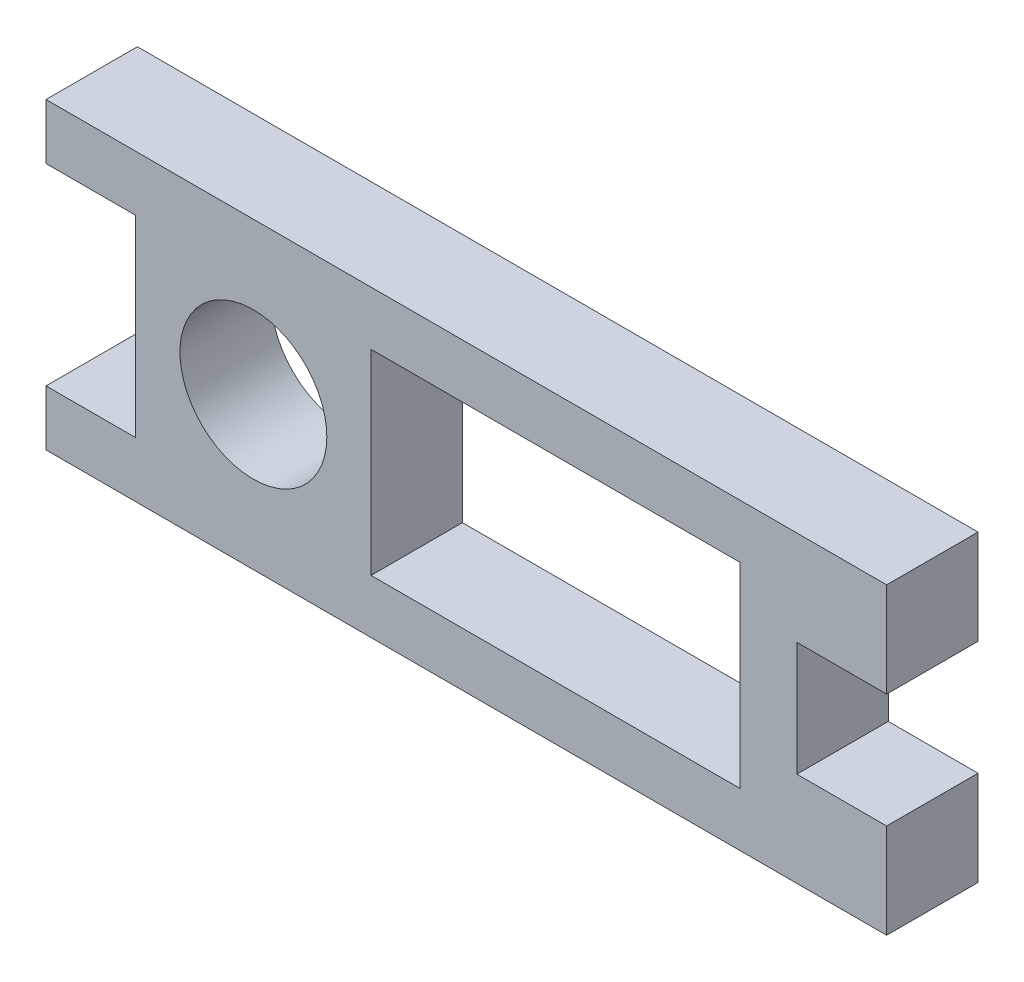
ISO-10303-21;
HEADER;
FILE_DESCRIPTION(('STEP AP214'),'2;1');
FILE_NAME('part.step','',(''),(''),'','','');
FILE_SCHEMA(('AUTOMOTIVE_DESIGN { 1 0 10303 214 1 1 1 1 }'));
ENDSEC;
DATA;
#1=APPLICATION_CONTEXT('core data for automotive mechanical design processes');
#2=APPLICATION_PROTOCOL_DEFINITION('international standard','automotive_design',2000,#1);
#3=PRODUCT_CONTEXT('',#1,'mechanical');
#4=PRODUCT('Part','Part','',(#3));
#5=PRODUCT_RELATED_PRODUCT_CATEGORY('part','',(#4));
#6=PRODUCT_DEFINITION_FORMATION('','',#4);
#7=PRODUCT_DEFINITION_CONTEXT('part definition',#1,'design');
#8=PRODUCT_DEFINITION('design','',#6,#7);
#9=PRODUCT_DEFINITION_SHAPE('','',#8);
#10=(LENGTH_UNIT() NAMED_UNIT(*) SI_UNIT(.MILLI.,.METRE.));
#11=(NAMED_UNIT(*) PLANE_ANGLE_UNIT() SI_UNIT($,.RADIAN.));
#12=(NAMED_UNIT(*) SI_UNIT($,.STERADIAN.) SOLID_ANGLE_UNIT());
#13=UNCERTAINTY_MEASURE_WITH_UNIT(LENGTH_MEASURE(1.E-05),#10,'distance_accuracy_value','');
#14=(GEOMETRIC_REPRESENTATION_CONTEXT(3) GLOBAL_UNCERTAINTY_ASSIGNED_CONTEXT((#13)) GLOBAL_UNIT_ASSIGNED_CONTEXT((#10,
#11,#12)) REPRESENTATION_CONTEXT('',''));
#15=CARTESIAN_POINT('',(0.,0.,0.));
#16=DIRECTION('',(0.,0.,1.));
#17=DIRECTION('',(1.,0.,0.));
#18=AXIS2_PLACEMENT_3D('',#15,#16,#17);
#19=CARTESIAN_POINT('',(0.,0.,5.6));
#20=DIRECTION('',(0.,0.,-1.));
#21=DIRECTION('',(-1.,0.,0.));
#22=AXIS2_PLACEMENT_3D('',#19,#20,#21);
#23=PLANE('',#22);
#24=DIRECTION('',(1.,0.,0.));
#25=VECTOR('',#24,1.);
#26=CARTESIAN_POINT('',(704.254416841144,403.699543708958,5.6));
#27=LINE('',#26,#25);
#28=CARTESIAN_POINT('',(698.754416841144,403.699543708958,5.6));
#29=VERTEX_POINT('',#28);
#30=CARTESIAN_POINT('',(704.254416841144,403.699543708958,5.6));
#31=VERTEX_POINT('',#30);
#32=EDGE_CURVE('E185',#29,#31,#27,.T.);
#33=ORIENTED_EDGE('',*,*,#32,.T.);
#34=DIRECTION('',(0.,-1.,0.));
#35=VECTOR('',#34,1.);
#36=CARTESIAN_POINT('',(704.254416841144,403.699543708958,5.6));
#37=LINE('',#36,#35);
#38=CARTESIAN_POINT('',(704.254416841144,391.899543708958,5.6));
#39=VERTEX_POINT('',#38);
#40=EDGE_CURVE('E188',#31,#39,#37,.T.);
#41=ORIENTED_EDGE('',*,*,#40,.T.);
#42=DIRECTION('',(-1.,0.,0.));
#43=VECTOR('',#42,1.);
#44=CARTESIAN_POINT('',(698.754416841144,391.899543708958,5.6));
#45=LINE('',#44,#43);
#46=CARTESIAN_POINT('',(698.754416841144,391.899543708958,5.6));
#47=VERTEX_POINT('',#46);
#48=EDGE_CURVE('E191',#39,#47,#45,.T.);
#49=ORIENTED_EDGE('',*,*,#48,.T.);
#50=DIRECTION('',(0.,-1.,0.));
#51=VECTOR('',#50,1.);
#52=CARTESIAN_POINT('',(698.754416841144,388.499543708958,5.6));
#53=LINE('',#52,#51);
#54=CARTESIAN_POINT('',(698.754416841144,388.499543708958,5.6));
#55=VERTEX_POINT('',#54);
#56=EDGE_CURVE('E193',#47,#55,#53,.T.);
#57=ORIENTED_EDGE('',*,*,#56,.T.);
#58=DIRECTION('',(1.,0.,0.));
#59=VECTOR('',#58,1.);
#60=CARTESIAN_POINT('',(750.274416841144,388.499543708958,5.6));
#61=LINE('',#60,#59);
#62=CARTESIAN_POINT('',(750.274416841144,388.499543708958,5.6));
#63=VERTEX_POINT('',#62);
#64=EDGE_CURVE('E195',#55,#63,#61,.T.);
#65=ORIENTED_EDGE('',*,*,#64,.T.);
#66=DIRECTION('',(0.,1.,0.));
#67=VECTOR('',#66,1.);
#68=CARTESIAN_POINT('',(750.274416841144,394.299543708958,5.6));
#69=LINE('',#68,#67);
#70=CARTESIAN_POINT('',(750.274416841144,394.299543708958,5.6));
#71=VERTEX_POINT('',#70);
#72=EDGE_CURVE('E197',#63,#71,#69,.T.);
#73=ORIENTED_EDGE('',*,*,#72,.T.);
#74=DIRECTION('',(-1.,0.,0.));
#75=VECTOR('',#74,1.);
#76=CARTESIAN_POINT('',(744.774416841144,394.299543708958,5.6));
#77=LINE('',#76,#75);
#78=CARTESIAN_POINT('',(744.774416841144,394.299543708958,5.6));
#79=VERTEX_POINT('',#78);
#80=EDGE_CURVE('E199',#71,#79,#77,.T.);
#81=ORIENTED_EDGE('',*,*,#80,.T.);
#82=DIRECTION('',(0.,1.,0.));
#83=VECTOR('',#82,1.);
#84=CARTESIAN_POINT('',(744.774416841144,401.299543708958,5.6));
#85=LINE('',#84,#83);
#86=CARTESIAN_POINT('',(744.774416841144,401.299543708958,5.6));
#87=VERTEX_POINT('',#86);
#88=EDGE_CURVE('E201',#79,#87,#85,.T.);
#89=ORIENTED_EDGE('',*,*,#88,.T.);
#90=DIRECTION('',(1.,0.,0.));
#91=VECTOR('',#90,1.);
#92=CARTESIAN_POINT('',(750.274416841144,401.299543708958,5.6));
#93=LINE('',#92,#91);
#94=CARTESIAN_POINT('',(750.274416841144,401.299543708958,5.6));
#95=VERTEX_POINT('',#94);
#96=EDGE_CURVE('E203',#87,#95,#93,.T.);
#97=ORIENTED_EDGE('',*,*,#96,.T.);
#98=DIRECTION('',(0.,1.,0.));
#99=VECTOR('',#98,1.);
#100=CARTESIAN_POINT('',(750.274416841144,407.099543708958,5.6));
#101=LINE('',#100,#99);
#102=CARTESIAN_POINT('',(750.274416841144,407.099543708958,5.6));
#103=VERTEX_POINT('',#102);
#104=EDGE_CURVE('E205',#95,#103,#101,.T.);
#105=ORIENTED_EDGE('',*,*,#104,.T.);
#106=DIRECTION('',(-1.,0.,0.));
#107=VECTOR('',#106,1.);
#108=CARTESIAN_POINT('',(698.754416841144,407.099543708958,5.6));
#109=LINE('',#108,#107);
#110=CARTESIAN_POINT('',(698.754416841144,407.099543708958,5.6));
#111=VERTEX_POINT('',#110);
#112=EDGE_CURVE('E207',#103,#111,#109,.T.);
#113=ORIENTED_EDGE('',*,*,#112,.T.);
#114=DIRECTION('',(0.,-1.,0.));
#115=VECTOR('',#114,1.);
#116=CARTESIAN_POINT('',(698.754416841144,403.699543708958,5.6));
#117=LINE('',#116,#115);
#118=EDGE_CURVE('E209',#111,#29,#117,.T.);
#119=ORIENTED_EDGE('',*,*,#118,.T.);
#120=EDGE_LOOP('',(#33,#41,#49,#57,#65,#73,#81,#89,#97,#105,#113,#119));
#121=FACE_BOUND('',#120,.T.);
#122=DIRECTION('',(0.,-1.,0.));
#123=VECTOR('',#122,1.);
#124=CARTESIAN_POINT('',(718.674416841144,391.799543708958,5.6));
#125=LINE('',#124,#123);
#126=CARTESIAN_POINT('',(718.674416841144,403.799543708958,5.6));
#127=VERTEX_POINT('',#126);
#128=CARTESIAN_POINT('',(718.674416841144,391.799543708958,5.6));
#129=VERTEX_POINT('',#128);
#130=EDGE_CURVE('E146',#127,#129,#125,.T.);
#131=ORIENTED_EDGE('',*,*,#130,.F.);
#132=DIRECTION('',(-1.,0.,0.));
#133=VECTOR('',#132,1.);
#134=CARTESIAN_POINT('',(718.674416841144,403.799543708958,5.6));
#135=LINE('',#134,#133);
#136=CARTESIAN_POINT('',(741.274416841144,403.799543708958,5.6));
#137=VERTEX_POINT('',#136);
#138=EDGE_CURVE('E169',#137,#127,#135,.T.);
#139=ORIENTED_EDGE('',*,*,#138,.F.);
#140=DIRECTION('',(0.,1.,0.));
#141=VECTOR('',#140,1.);
#142=CARTESIAN_POINT('',(741.274416841144,391.799543708958,5.6));
#143=LINE('',#142,#141);
#144=CARTESIAN_POINT('',(741.274416841144,391.799543708958,5.6));
#145=VERTEX_POINT('',#144);
#146=EDGE_CURVE('E167',#145,#137,#143,.T.);
#147=ORIENTED_EDGE('',*,*,#146,.F.);
#148=DIRECTION('',(1.,0.,0.));
#149=VECTOR('',#148,1.);
#150=CARTESIAN_POINT('',(718.674416841144,391.799543708958,5.6));
#151=LINE('',#150,#149);
#152=EDGE_CURVE('E154',#129,#145,#151,.T.);
#153=ORIENTED_EDGE('',*,*,#152,.F.);
#154=EDGE_LOOP('',(#131,#139,#147,#153));
#155=FACE_BOUND('',#154,.T.);
#156=CARTESIAN_POINT('',(711.464416841144,397.799543708958,5.6));
#157=DIRECTION('',(0.,0.,1.));
#158=DIRECTION('',(1.,0.,0.));
#159=AXIS2_PLACEMENT_3D('',#156,#157,#158);
#160=CIRCLE('',#159,4.49999999999991);
#161=CARTESIAN_POINT('',(715.964416841144,397.799543708958,5.6));
#162=VERTEX_POINT('',#161);
#163=EDGE_CURVE('E175',#162,#162,#160,.T.);
#164=ORIENTED_EDGE('',*,*,#163,.F.);
#165=EDGE_LOOP('',(#164));
#166=FACE_BOUND('',#165,.T.);
#167=ADVANCED_FACE('F33',(#121,#155,#166),#23,.F.);
#168=CARTESIAN_POINT('',(0.,0.,0.));
#169=DIRECTION('',(0.,0.,-1.));
#170=DIRECTION('',(-1.,0.,0.));
#171=AXIS2_PLACEMENT_3D('',#168,#169,#170);
#172=PLANE('',#171);
#173=DIRECTION('',(-1.,0.,0.));
#174=VECTOR('',#173,1.);
#175=CARTESIAN_POINT('',(718.674416841144,403.799543708958,0.));
#176=LINE('',#175,#174);
#177=CARTESIAN_POINT('',(741.274416841144,403.799543708958,0.));
#178=VERTEX_POINT('',#177);
#179=CARTESIAN_POINT('',(718.674416841144,403.799543708958,0.));
#180=VERTEX_POINT('',#179);
#181=EDGE_CURVE('E155',#178,#180,#176,.T.);
#182=ORIENTED_EDGE('',*,*,#181,.T.);
#183=DIRECTION('',(0.,-1.,0.));
#184=VECTOR('',#183,1.);
#185=CARTESIAN_POINT('',(718.674416841144,391.799543708958,0.));
#186=LINE('',#185,#184);
#187=CARTESIAN_POINT('',(718.674416841144,391.799543708958,0.));
#188=VERTEX_POINT('',#187);
#189=EDGE_CURVE('E56',#180,#188,#186,.T.);
#190=ORIENTED_EDGE('',*,*,#189,.T.);
#191=DIRECTION('',(1.,0.,0.));
#192=VECTOR('',#191,1.);
#193=CARTESIAN_POINT('',(718.674416841144,391.799543708958,0.));
#194=LINE('',#193,#192);
#195=CARTESIAN_POINT('',(741.274416841144,391.799543708958,0.));
#196=VERTEX_POINT('',#195);
#197=EDGE_CURVE('E161',#188,#196,#194,.T.);
#198=ORIENTED_EDGE('',*,*,#197,.T.);
#199=DIRECTION('',(0.,1.,0.));
#200=VECTOR('',#199,1.);
#201=CARTESIAN_POINT('',(741.274416841144,391.799543708958,0.));
#202=LINE('',#201,#200);
#203=EDGE_CURVE('E177',#196,#178,#202,.T.);
#204=ORIENTED_EDGE('',*,*,#203,.T.);
#205=EDGE_LOOP('',(#182,#190,#198,#204));
#206=FACE_BOUND('',#205,.T.);
#207=DIRECTION('',(1.,0.,0.));
#208=VECTOR('',#207,1.);
#209=CARTESIAN_POINT('',(704.254416841144,403.699543708958,0.));
#210=LINE('',#209,#208);
#211=CARTESIAN_POINT('',(698.754416841144,403.699543708958,0.));
#212=VERTEX_POINT('',#211);
#213=CARTESIAN_POINT('',(704.254416841144,403.699543708958,0.));
#214=VERTEX_POINT('',#213);
#215=EDGE_CURVE('E162',#212,#214,#210,.T.);
#216=ORIENTED_EDGE('',*,*,#215,.F.);
#217=DIRECTION('',(0.,-1.,0.));
#218=VECTOR('',#217,1.);
#219=CARTESIAN_POINT('',(698.754416841144,403.699543708958,0.));
#220=LINE('',#219,#218);
#221=CARTESIAN_POINT('',(698.754416841144,407.099543708958,0.));
#222=VERTEX_POINT('',#221);
#223=EDGE_CURVE('E189',#222,#212,#220,.T.);
#224=ORIENTED_EDGE('',*,*,#223,.F.);
#225=DIRECTION('',(-1.,0.,0.));
#226=VECTOR('',#225,1.);
#227=CARTESIAN_POINT('',(698.754416841144,407.099543708958,0.));
#228=LINE('',#227,#226);
#229=CARTESIAN_POINT('',(750.274416841144,407.099543708958,0.));
#230=VERTEX_POINT('',#229);
#231=EDGE_CURVE('E232',#230,#222,#228,.T.);
#232=ORIENTED_EDGE('',*,*,#231,.F.);
#233=DIRECTION('',(0.,1.,0.));
#234=VECTOR('',#233,1.);
#235=CARTESIAN_POINT('',(750.274416841144,407.099543708958,0.));
#236=LINE('',#235,#234);
#237=CARTESIAN_POINT('',(750.274416841144,401.299543708958,0.));
#238=VERTEX_POINT('',#237);
#239=EDGE_CURVE('E230',#238,#230,#236,.T.);
#240=ORIENTED_EDGE('',*,*,#239,.F.);
#241=DIRECTION('',(1.,0.,0.));
#242=VECTOR('',#241,1.);
#243=CARTESIAN_POINT('',(750.274416841144,401.299543708958,0.));
#244=LINE('',#243,#242);
#245=CARTESIAN_POINT('',(744.774416841144,401.299543708958,0.));
#246=VERTEX_POINT('',#245);
#247=EDGE_CURVE('E228',#246,#238,#244,.T.);
#248=ORIENTED_EDGE('',*,*,#247,.F.);
#249=DIRECTION('',(0.,1.,0.));
#250=VECTOR('',#249,1.);
#251=CARTESIAN_POINT('',(744.774416841144,401.299543708958,0.));
#252=LINE('',#251,#250);
#253=CARTESIAN_POINT('',(744.774416841144,394.299543708958,0.));
#254=VERTEX_POINT('',#253);
#255=EDGE_CURVE('E226',#254,#246,#252,.T.);
#256=ORIENTED_EDGE('',*,*,#255,.F.);
#257=DIRECTION('',(-1.,0.,0.));
#258=VECTOR('',#257,1.);
#259=CARTESIAN_POINT('',(744.774416841144,394.299543708958,0.));
#260=LINE('',#259,#258);
#261=CARTESIAN_POINT('',(750.274416841144,394.299543708958,0.));
#262=VERTEX_POINT('',#261);
#263=EDGE_CURVE('E224',#262,#254,#260,.T.);
#264=ORIENTED_EDGE('',*,*,#263,.F.);
#265=DIRECTION('',(0.,1.,0.));
#266=VECTOR('',#265,1.);
#267=CARTESIAN_POINT('',(750.274416841144,394.299543708958,0.));
#268=LINE('',#267,#266);
#269=CARTESIAN_POINT('',(750.274416841144,388.499543708958,0.));
#270=VERTEX_POINT('',#269);
#271=EDGE_CURVE('E222',#270,#262,#268,.T.);
#272=ORIENTED_EDGE('',*,*,#271,.F.);
#273=DIRECTION('',(1.,0.,0.));
#274=VECTOR('',#273,1.);
#275=CARTESIAN_POINT('',(750.274416841144,388.499543708958,0.));
#276=LINE('',#275,#274);
#277=CARTESIAN_POINT('',(698.754416841144,388.499543708958,0.));
#278=VERTEX_POINT('',#277);
#279=EDGE_CURVE('E220',#278,#270,#276,.T.);
#280=ORIENTED_EDGE('',*,*,#279,.F.);
#281=DIRECTION('',(0.,-1.,0.));
#282=VECTOR('',#281,1.);
#283=CARTESIAN_POINT('',(698.754416841144,388.499543708958,0.));
#284=LINE('',#283,#282);
#285=CARTESIAN_POINT('',(698.754416841144,391.899543708958,0.));
#286=VERTEX_POINT('',#285);
#287=EDGE_CURVE('E218',#286,#278,#284,.T.);
#288=ORIENTED_EDGE('',*,*,#287,.F.);
#289=DIRECTION('',(-1.,0.,0.));
#290=VECTOR('',#289,1.);
#291=CARTESIAN_POINT('',(698.754416841144,391.899543708958,0.));
#292=LINE('',#291,#290);
#293=CARTESIAN_POINT('',(704.254416841144,391.899543708958,0.));
#294=VERTEX_POINT('',#293);
#295=EDGE_CURVE('E216',#294,#286,#292,.T.);
#296=ORIENTED_EDGE('',*,*,#295,.F.);
#297=DIRECTION('',(0.,-1.,0.));
#298=VECTOR('',#297,1.);
#299=CARTESIAN_POINT('',(704.254416841144,403.699543708958,0.));
#300=LINE('',#299,#298);
#301=EDGE_CURVE('E214',#214,#294,#300,.T.);
#302=ORIENTED_EDGE('',*,*,#301,.F.);
#303=EDGE_LOOP('',(#216,#224,#232,#240,#248,#256,#264,#272,#280,#288,#296,#302));
#304=FACE_BOUND('',#303,.T.);
#305=CARTESIAN_POINT('',(711.464416841144,397.799543708958,0.));
#306=DIRECTION('',(0.,0.,1.));
#307=DIRECTION('',(1.,0.,0.));
#308=AXIS2_PLACEMENT_3D('',#305,#306,#307);
#309=CIRCLE('',#308,4.49999999999991);
#310=CARTESIAN_POINT('',(715.964416841144,397.799543708958,0.));
#311=VERTEX_POINT('',#310);
#312=EDGE_CURVE('E486',#311,#311,#309,.T.);
#313=ORIENTED_EDGE('',*,*,#312,.T.);
#314=EDGE_LOOP('',(#313));
#315=FACE_BOUND('',#314,.T.);
#316=ADVANCED_FACE('F274',(#206,#304,#315),#172,.T.);
#317=CARTESIAN_POINT('',(704.254416841144,403.699543708958,5.6));
#318=DIRECTION('',(0.,1.,0.));
#319=DIRECTION('',(0.,0.,1.));
#320=AXIS2_PLACEMENT_3D('',#317,#318,#319);
#321=PLANE('',#320);
#322=ORIENTED_EDGE('',*,*,#215,.T.);
#323=DIRECTION('',(0.,0.,-1.));
#324=VECTOR('',#323,1.);
#325=CARTESIAN_POINT('',(704.254416841144,403.699543708958,5.6));
#326=LINE('',#325,#324);
#327=EDGE_CURVE('E11',#31,#214,#326,.T.);
#328=ORIENTED_EDGE('',*,*,#327,.F.);
#329=ORIENTED_EDGE('',*,*,#32,.F.);
#330=DIRECTION('',(0.,0.,-1.));
#331=VECTOR('',#330,1.);
#332=CARTESIAN_POINT('',(698.754416841144,403.699543708958,5.6));
#333=LINE('',#332,#331);
#334=EDGE_CURVE('E211',#29,#212,#333,.T.);
#335=ORIENTED_EDGE('',*,*,#334,.T.);
#336=EDGE_LOOP('',(#322,#328,#329,#335));
#337=FACE_BOUND('',#336,.T.);
#338=ADVANCED_FACE('F35',(#337),#321,.F.);
#339=CARTESIAN_POINT('',(704.254416841144,403.699543708958,5.6));
#340=DIRECTION('',(1.,0.,0.));
#341=DIRECTION('',(0.,0.,-1.));
#342=AXIS2_PLACEMENT_3D('',#339,#340,#341);
#343=PLANE('',#342);
#344=ORIENTED_EDGE('',*,*,#301,.T.);
#345=DIRECTION('',(0.,0.,-1.));
#346=VECTOR('',#345,1.);
#347=CARTESIAN_POINT('',(704.254416841144,391.899543708958,5.6));
#348=LINE('',#347,#346);
#349=EDGE_CURVE('E41',#39,#294,#348,.T.);
#350=ORIENTED_EDGE('',*,*,#349,.F.);
#351=ORIENTED_EDGE('',*,*,#40,.F.);
#352=ORIENTED_EDGE('',*,*,#327,.T.);
#353=EDGE_LOOP('',(#344,#350,#351,#352));
#354=FACE_BOUND('',#353,.T.);
#355=ADVANCED_FACE('F291',(#354),#343,.F.);
#356=CARTESIAN_POINT('',(698.754416841144,391.899543708958,5.6));
#357=DIRECTION('',(0.,-1.,0.));
#358=DIRECTION('',(0.,0.,-1.));
#359=AXIS2_PLACEMENT_3D('',#356,#357,#358);
#360=PLANE('',#359);
#361=ORIENTED_EDGE('',*,*,#295,.T.);
#362=DIRECTION('',(0.,0.,-1.));
#363=VECTOR('',#362,1.);
#364=CARTESIAN_POINT('',(698.754416841144,391.899543708958,5.6));
#365=LINE('',#364,#363);
#366=EDGE_CURVE('E261',#47,#286,#365,.T.);
#367=ORIENTED_EDGE('',*,*,#366,.F.);
#368=ORIENTED_EDGE('',*,*,#48,.F.);
#369=ORIENTED_EDGE('',*,*,#349,.T.);
#370=EDGE_LOOP('',(#361,#367,#368,#369));
#371=FACE_BOUND('',#370,.T.);
#372=ADVANCED_FACE('F268',(#371),#360,.F.);
#373=CARTESIAN_POINT('',(698.754416841144,388.499543708958,5.6));
#374=DIRECTION('',(1.,0.,0.));
#375=DIRECTION('',(0.,1.,0.));
#376=AXIS2_PLACEMENT_3D('',#373,#374,#375);
#377=PLANE('',#376);
#378=ORIENTED_EDGE('',*,*,#287,.T.);
#379=DIRECTION('',(0.,0.,-1.));
#380=VECTOR('',#379,1.);
#381=CARTESIAN_POINT('',(698.754416841144,388.499543708958,5.6));
#382=LINE('',#381,#380);
#383=EDGE_CURVE('E258',#55,#278,#382,.T.);
#384=ORIENTED_EDGE('',*,*,#383,.F.);
#385=ORIENTED_EDGE('',*,*,#56,.F.);
#386=ORIENTED_EDGE('',*,*,#366,.T.);
#387=EDGE_LOOP('',(#378,#384,#385,#386));
#388=FACE_BOUND('',#387,.T.);
#389=ADVANCED_FACE('F280',(#388),#377,.F.);
#390=CARTESIAN_POINT('',(750.274416841144,388.499543708958,5.6));
#391=DIRECTION('',(0.,1.,0.));
#392=DIRECTION('',(0.,0.,1.));
#393=AXIS2_PLACEMENT_3D('',#390,#391,#392);
#394=PLANE('',#393);
#395=ORIENTED_EDGE('',*,*,#279,.T.);
#396=DIRECTION('',(0.,0.,-1.));
#397=VECTOR('',#396,1.);
#398=CARTESIAN_POINT('',(750.274416841144,388.499543708958,5.6));
#399=LINE('',#398,#397);
#400=EDGE_CURVE('E255',#63,#270,#399,.T.);
#401=ORIENTED_EDGE('',*,*,#400,.F.);
#402=ORIENTED_EDGE('',*,*,#64,.F.);
#403=ORIENTED_EDGE('',*,*,#383,.T.);
#404=EDGE_LOOP('',(#395,#401,#402,#403));
#405=FACE_BOUND('',#404,.T.);
#406=ADVANCED_FACE('F284',(#405),#394,.F.);
#407=CARTESIAN_POINT('',(750.274416841144,394.299543708958,5.6));
#408=DIRECTION('',(-1.,0.,0.));
#409=DIRECTION('',(0.,0.,1.));
#410=AXIS2_PLACEMENT_3D('',#407,#408,#409);
#411=PLANE('',#410);
#412=ORIENTED_EDGE('',*,*,#271,.T.);
#413=DIRECTION('',(0.,0.,-1.));
#414=VECTOR('',#413,1.);
#415=CARTESIAN_POINT('',(750.274416841144,394.299543708958,5.6));
#416=LINE('',#415,#414);
#417=EDGE_CURVE('E252',#71,#262,#416,.T.);
#418=ORIENTED_EDGE('',*,*,#417,.F.);
#419=ORIENTED_EDGE('',*,*,#72,.F.);
#420=ORIENTED_EDGE('',*,*,#400,.T.);
#421=EDGE_LOOP('',(#412,#418,#419,#420));
#422=FACE_BOUND('',#421,.T.);
#423=ADVANCED_FACE('F324',(#422),#411,.F.);
#424=CARTESIAN_POINT('',(744.774416841144,394.299543708958,5.6));
#425=DIRECTION('',(0.,-1.,0.));
#426=DIRECTION('',(1.,0.,0.));
#427=AXIS2_PLACEMENT_3D('',#424,#425,#426);
#428=PLANE('',#427);
#429=ORIENTED_EDGE('',*,*,#263,.T.);
#430=DIRECTION('',(0.,0.,-1.));
#431=VECTOR('',#430,1.);
#432=CARTESIAN_POINT('',(744.774416841144,394.299543708958,5.6));
#433=LINE('',#432,#431);
#434=EDGE_CURVE('E249',#79,#254,#433,.T.);
#435=ORIENTED_EDGE('',*,*,#434,.F.);
#436=ORIENTED_EDGE('',*,*,#80,.F.);
#437=ORIENTED_EDGE('',*,*,#417,.T.);
#438=EDGE_LOOP('',(#429,#435,#436,#437));
#439=FACE_BOUND('',#438,.T.);
#440=ADVANCED_FACE('F322',(#439),#428,.F.);
#441=CARTESIAN_POINT('',(744.774416841144,401.299543708958,5.6));
#442=DIRECTION('',(-1.,0.,0.));
#443=DIRECTION('',(0.,0.,1.));
#444=AXIS2_PLACEMENT_3D('',#441,#442,#443);
#445=PLANE('',#444);
#446=ORIENTED_EDGE('',*,*,#255,.T.);
#447=DIRECTION('',(0.,0.,-1.));
#448=VECTOR('',#447,1.);
#449=CARTESIAN_POINT('',(744.774416841144,401.299543708958,5.6));
#450=LINE('',#449,#448);
#451=EDGE_CURVE('E246',#87,#246,#450,.T.);
#452=ORIENTED_EDGE('',*,*,#451,.F.);
#453=ORIENTED_EDGE('',*,*,#88,.F.);
#454=ORIENTED_EDGE('',*,*,#434,.T.);
#455=EDGE_LOOP('',(#446,#452,#453,#454));
#456=FACE_BOUND('',#455,.T.);
#457=ADVANCED_FACE('F318',(#456),#445,.F.);
#458=CARTESIAN_POINT('',(750.274416841144,401.299543708958,5.6));
#459=DIRECTION('',(0.,1.,0.));
#460=DIRECTION('',(-1.,0.,0.));
#461=AXIS2_PLACEMENT_3D('',#458,#459,#460);
#462=PLANE('',#461);
#463=ORIENTED_EDGE('',*,*,#247,.T.);
#464=DIRECTION('',(0.,0.,-1.));
#465=VECTOR('',#464,1.);
#466=CARTESIAN_POINT('',(750.274416841144,401.299543708958,5.6));
#467=LINE('',#466,#465);
#468=EDGE_CURVE('E243',#95,#238,#467,.T.);
#469=ORIENTED_EDGE('',*,*,#468,.F.);
#470=ORIENTED_EDGE('',*,*,#96,.F.);
#471=ORIENTED_EDGE('',*,*,#451,.T.);
#472=EDGE_LOOP('',(#463,#469,#470,#471));
#473=FACE_BOUND('',#472,.T.);
#474=ADVANCED_FACE('F313',(#473),#462,.F.);
#475=CARTESIAN_POINT('',(750.274416841144,407.099543708958,5.6));
#476=DIRECTION('',(-1.,0.,0.));
#477=DIRECTION('',(0.,0.,1.));
#478=AXIS2_PLACEMENT_3D('',#475,#476,#477);
#479=PLANE('',#478);
#480=ORIENTED_EDGE('',*,*,#239,.T.);
#481=DIRECTION('',(0.,0.,-1.));
#482=VECTOR('',#481,1.);
#483=CARTESIAN_POINT('',(750.274416841144,407.099543708958,5.6));
#484=LINE('',#483,#482);
#485=EDGE_CURVE('E240',#103,#230,#484,.T.);
#486=ORIENTED_EDGE('',*,*,#485,.F.);
#487=ORIENTED_EDGE('',*,*,#104,.F.);
#488=ORIENTED_EDGE('',*,*,#468,.T.);
#489=EDGE_LOOP('',(#480,#486,#487,#488));
#490=FACE_BOUND('',#489,.T.);
#491=ADVANCED_FACE('F307',(#490),#479,.F.);
#492=CARTESIAN_POINT('',(698.754416841144,407.099543708958,5.6));
#493=DIRECTION('',(0.,-1.,0.));
#494=DIRECTION('',(0.,0.,-1.));
#495=AXIS2_PLACEMENT_3D('',#492,#493,#494);
#496=PLANE('',#495);
#497=ORIENTED_EDGE('',*,*,#231,.T.);
#498=DIRECTION('',(0.,0.,-1.));
#499=VECTOR('',#498,1.);
#500=CARTESIAN_POINT('',(698.754416841144,407.099543708958,5.6));
#501=LINE('',#500,#499);
#502=EDGE_CURVE('E237',#111,#222,#501,.T.);
#503=ORIENTED_EDGE('',*,*,#502,.F.);
#504=ORIENTED_EDGE('',*,*,#112,.F.);
#505=ORIENTED_EDGE('',*,*,#485,.T.);
#506=EDGE_LOOP('',(#497,#503,#504,#505));
#507=FACE_BOUND('',#506,.T.);
#508=ADVANCED_FACE('F303',(#507),#496,.F.);
#509=CARTESIAN_POINT('',(698.754416841144,403.699543708958,5.6));
#510=DIRECTION('',(1.,0.,0.));
#511=DIRECTION('',(0.,1.,0.));
#512=AXIS2_PLACEMENT_3D('',#509,#510,#511);
#513=PLANE('',#512);
#514=ORIENTED_EDGE('',*,*,#223,.T.);
#515=ORIENTED_EDGE('',*,*,#334,.F.);
#516=ORIENTED_EDGE('',*,*,#118,.F.);
#517=ORIENTED_EDGE('',*,*,#502,.T.);
#518=EDGE_LOOP('',(#514,#515,#516,#517));
#519=FACE_BOUND('',#518,.T.);
#520=ADVANCED_FACE('F298',(#519),#513,.F.);
#521=CARTESIAN_POINT('',(718.674416841144,391.799543708958,5.6));
#522=DIRECTION('',(1.,0.,0.));
#523=DIRECTION('',(0.,0.,-1.));
#524=AXIS2_PLACEMENT_3D('',#521,#522,#523);
#525=PLANE('',#524);
#526=ORIENTED_EDGE('',*,*,#189,.F.);
#527=DIRECTION('',(0.,0.,-1.));
#528=VECTOR('',#527,1.);
#529=CARTESIAN_POINT('',(718.674416841144,403.799543708958,5.6));
#530=LINE('',#529,#528);
#531=EDGE_CURVE('E150',#127,#180,#530,.T.);
#532=ORIENTED_EDGE('',*,*,#531,.F.);
#533=ORIENTED_EDGE('',*,*,#130,.T.);
#534=DIRECTION('',(0.,0.,-1.));
#535=VECTOR('',#534,1.);
#536=CARTESIAN_POINT('',(718.674416841144,391.799543708958,5.6));
#537=LINE('',#536,#535);
#538=EDGE_CURVE('E149',#129,#188,#537,.T.);
#539=ORIENTED_EDGE('',*,*,#538,.T.);
#540=EDGE_LOOP('',(#526,#532,#533,#539));
#541=FACE_BOUND('',#540,.T.);
#542=ADVANCED_FACE('F148',(#541),#525,.T.);
#543=CARTESIAN_POINT('',(718.674416841144,391.799543708958,5.6));
#544=DIRECTION('',(0.,1.,0.));
#545=DIRECTION('',(0.,0.,1.));
#546=AXIS2_PLACEMENT_3D('',#543,#544,#545);
#547=PLANE('',#546);
#548=ORIENTED_EDGE('',*,*,#197,.F.);
#549=ORIENTED_EDGE('',*,*,#538,.F.);
#550=ORIENTED_EDGE('',*,*,#152,.T.);
#551=DIRECTION('',(0.,0.,-1.));
#552=VECTOR('',#551,1.);
#553=CARTESIAN_POINT('',(741.274416841144,391.799543708958,5.6));
#554=LINE('',#553,#552);
#555=EDGE_CURVE('E163',#145,#196,#554,.T.);
#556=ORIENTED_EDGE('',*,*,#555,.T.);
#557=EDGE_LOOP('',(#548,#549,#550,#556));
#558=FACE_BOUND('',#557,.T.);
#559=ADVANCED_FACE('F158',(#558),#547,.T.);
#560=CARTESIAN_POINT('',(741.274416841144,391.799543708958,5.6));
#561=DIRECTION('',(-1.,0.,0.));
#562=DIRECTION('',(0.,0.,1.));
#563=AXIS2_PLACEMENT_3D('',#560,#561,#562);
#564=PLANE('',#563);
#565=ORIENTED_EDGE('',*,*,#203,.F.);
#566=ORIENTED_EDGE('',*,*,#555,.F.);
#567=ORIENTED_EDGE('',*,*,#146,.T.);
#568=DIRECTION('',(0.,0.,-1.));
#569=VECTOR('',#568,1.);
#570=CARTESIAN_POINT('',(741.274416841144,403.799543708958,5.6));
#571=LINE('',#570,#569);
#572=EDGE_CURVE('E48',#137,#178,#571,.T.);
#573=ORIENTED_EDGE('',*,*,#572,.T.);
#574=EDGE_LOOP('',(#565,#566,#567,#573));
#575=FACE_BOUND('',#574,.T.);
#576=ADVANCED_FACE('F383',(#575),#564,.T.);
#577=CARTESIAN_POINT('',(718.674416841144,403.799543708958,5.6));
#578=DIRECTION('',(0.,-1.,0.));
#579=DIRECTION('',(0.,0.,-1.));
#580=AXIS2_PLACEMENT_3D('',#577,#578,#579);
#581=PLANE('',#580);
#582=ORIENTED_EDGE('',*,*,#181,.F.);
#583=ORIENTED_EDGE('',*,*,#572,.F.);
#584=ORIENTED_EDGE('',*,*,#138,.T.);
#585=ORIENTED_EDGE('',*,*,#531,.T.);
#586=EDGE_LOOP('',(#582,#583,#584,#585));
#587=FACE_BOUND('',#586,.T.);
#588=ADVANCED_FACE('F389',(#587),#581,.T.);
#589=CARTESIAN_POINT('',(711.464416841144,397.799543708958,5.6));
#590=DIRECTION('',(0.,0.,-1.));
#591=DIRECTION('',(-1.,0.,0.));
#592=AXIS2_PLACEMENT_3D('',#589,#590,#591);
#593=CYLINDRICAL_SURFACE('',#592,4.49999999999991);
#594=ORIENTED_EDGE('',*,*,#163,.T.);
#595=EDGE_LOOP('',(#594));
#596=FACE_BOUND('',#595,.T.);
#597=ORIENTED_EDGE('',*,*,#312,.F.);
#598=EDGE_LOOP('',(#597));
#599=FACE_BOUND('',#598,.T.);
#600=ADVANCED_FACE('F397',(#596,#599),#593,.F.);
#601=CLOSED_SHELL('',(#167,#316,#338,#355,#372,#389,#406,#423,#440,#457,#474,#491,#508,#520,
#542,#559,#576,#588,#600));
#602=MANIFOLD_SOLID_BREP('B2',#601);
#603=ADVANCED_BREP_SHAPE_REPRESENTATION('',(#18,#602),#14);
#604=SHAPE_DEFINITION_REPRESENTATION(#9,#603);
ENDSEC;
END-ISO-10303-21;
